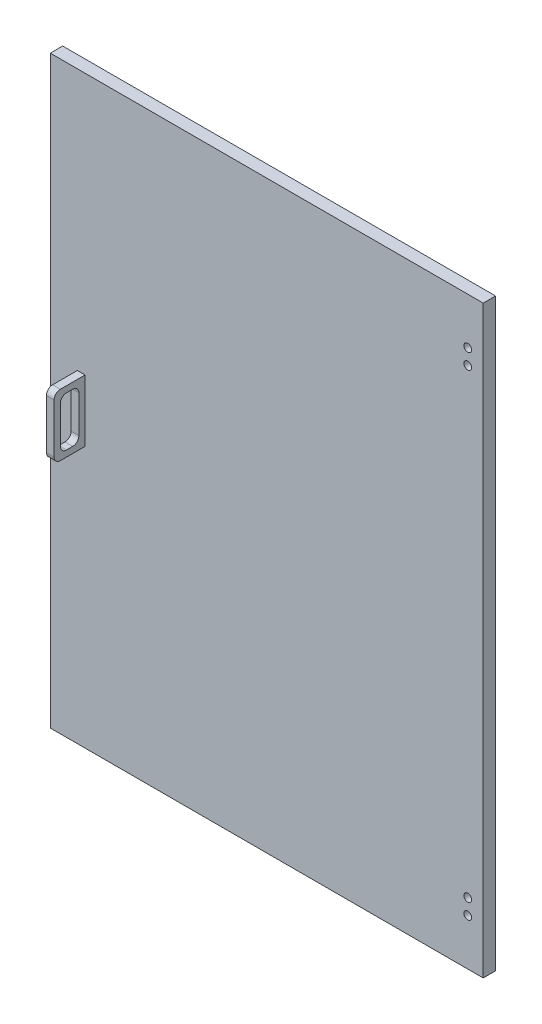
ISO-10303-21;
HEADER;
FILE_DESCRIPTION(('STEP AP214'),'2;1');
FILE_NAME('part.step','',(''),(''),'','','');
FILE_SCHEMA(('AUTOMOTIVE_DESIGN { 1 0 10303 214 1 1 1 1 }'));
ENDSEC;
DATA;
#1=APPLICATION_CONTEXT('core data for automotive mechanical design processes');
#2=APPLICATION_PROTOCOL_DEFINITION('international standard','automotive_design',2000,#1);
#3=PRODUCT_CONTEXT('',#1,'mechanical');
#4=PRODUCT('Part','Part','',(#3));
#5=PRODUCT_RELATED_PRODUCT_CATEGORY('part','',(#4));
#6=PRODUCT_DEFINITION_FORMATION('','',#4);
#7=PRODUCT_DEFINITION_CONTEXT('part definition',#1,'design');
#8=PRODUCT_DEFINITION('design','',#6,#7);
#9=PRODUCT_DEFINITION_SHAPE('','',#8);
#10=(LENGTH_UNIT() NAMED_UNIT(*) SI_UNIT(.MILLI.,.METRE.));
#11=(NAMED_UNIT(*) PLANE_ANGLE_UNIT() SI_UNIT($,.RADIAN.));
#12=(NAMED_UNIT(*) SI_UNIT($,.STERADIAN.) SOLID_ANGLE_UNIT());
#13=UNCERTAINTY_MEASURE_WITH_UNIT(LENGTH_MEASURE(1.E-05),#10,'distance_accuracy_value','');
#14=(GEOMETRIC_REPRESENTATION_CONTEXT(3) GLOBAL_UNCERTAINTY_ASSIGNED_CONTEXT((#13)) GLOBAL_UNIT_ASSIGNED_CONTEXT((#10,
#11,#12)) REPRESENTATION_CONTEXT('',''));
#15=CARTESIAN_POINT('',(0.,0.,0.));
#16=DIRECTION('',(0.,0.,1.));
#17=DIRECTION('',(1.,0.,0.));
#18=AXIS2_PLACEMENT_3D('',#15,#16,#17);
#19=CARTESIAN_POINT('',(0.,0.,0.));
#20=DIRECTION('',(0.,0.,1.));
#21=DIRECTION('',(1.,0.,0.));
#22=AXIS2_PLACEMENT_3D('',#19,#20,#21);
#23=PLANE('',#22);
#24=CARTESIAN_POINT('',(82.55,100.965,0.));
#25=DIRECTION('',(0.,0.,1.));
#26=DIRECTION('',(1.,0.,0.));
#27=AXIS2_PLACEMENT_3D('',#24,#25,#26);
#28=CIRCLE('',#27,1.58749999999999);
#29=CARTESIAN_POINT('',(84.1375,100.965,0.));
#30=VERTEX_POINT('',#29);
#31=EDGE_CURVE('E229',#30,#30,#28,.T.);
#32=ORIENTED_EDGE('',*,*,#31,.F.);
#33=EDGE_LOOP('',(#32));
#34=FACE_BOUND('',#33,.T.);
#35=CARTESIAN_POINT('',(82.55,94.615,0.));
#36=DIRECTION('',(0.,0.,1.));
#37=DIRECTION('',(1.,0.,0.));
#38=AXIS2_PLACEMENT_3D('',#35,#36,#37);
#39=CIRCLE('',#38,1.58749999999999);
#40=CARTESIAN_POINT('',(84.1375,94.615,0.));
#41=VERTEX_POINT('',#40);
#42=EDGE_CURVE('E233',#41,#41,#39,.T.);
#43=ORIENTED_EDGE('',*,*,#42,.F.);
#44=EDGE_LOOP('',(#43));
#45=FACE_BOUND('',#44,.T.);
#46=CARTESIAN_POINT('',(82.55,-94.615,0.));
#47=DIRECTION('',(0.,0.,1.));
#48=DIRECTION('',(-1.,0.,0.));
#49=AXIS2_PLACEMENT_3D('',#46,#47,#48);
#50=CIRCLE('',#49,1.58749999999999);
#51=CARTESIAN_POINT('',(80.9625,-94.615,0.));
#52=VERTEX_POINT('',#51);
#53=EDGE_CURVE('E241',#52,#52,#50,.T.);
#54=ORIENTED_EDGE('',*,*,#53,.F.);
#55=EDGE_LOOP('',(#54));
#56=FACE_BOUND('',#55,.T.);
#57=CARTESIAN_POINT('',(82.55,-100.965,0.));
#58=DIRECTION('',(0.,0.,1.));
#59=DIRECTION('',(-1.,0.,0.));
#60=AXIS2_PLACEMENT_3D('',#57,#58,#59);
#61=CIRCLE('',#60,1.58749999999999);
#62=CARTESIAN_POINT('',(80.9625,-100.965,0.));
#63=VERTEX_POINT('',#62);
#64=EDGE_CURVE('E249',#63,#63,#61,.T.);
#65=ORIENTED_EDGE('',*,*,#64,.F.);
#66=EDGE_LOOP('',(#65));
#67=FACE_BOUND('',#66,.T.);
#68=DIRECTION('',(0.,-1.,0.));
#69=VECTOR('',#68,1.);
#70=CARTESIAN_POINT('',(-88.9,120.015,0.));
#71=LINE('',#70,#69);
#72=CARTESIAN_POINT('',(-88.9,120.015,0.));
#73=VERTEX_POINT('',#72);
#74=CARTESIAN_POINT('',(-88.9,-120.015,0.));
#75=VERTEX_POINT('',#74);
#76=EDGE_CURVE('E228',#73,#75,#71,.T.);
#77=ORIENTED_EDGE('',*,*,#76,.T.);
#78=DIRECTION('',(1.,0.,0.));
#79=VECTOR('',#78,1.);
#80=CARTESIAN_POINT('',(-88.9,-120.015,0.));
#81=LINE('',#80,#79);
#82=CARTESIAN_POINT('',(88.9,-120.015,0.));
#83=VERTEX_POINT('',#82);
#84=EDGE_CURVE('E277',#75,#83,#81,.T.);
#85=ORIENTED_EDGE('',*,*,#84,.T.);
#86=DIRECTION('',(0.,1.,0.));
#87=VECTOR('',#86,1.);
#88=CARTESIAN_POINT('',(88.9,120.015,0.));
#89=LINE('',#88,#87);
#90=CARTESIAN_POINT('',(88.9,120.015,0.));
#91=VERTEX_POINT('',#90);
#92=EDGE_CURVE('E281',#83,#91,#89,.T.);
#93=ORIENTED_EDGE('',*,*,#92,.T.);
#94=DIRECTION('',(-1.,0.,0.));
#95=VECTOR('',#94,1.);
#96=CARTESIAN_POINT('',(-88.9,120.015,0.));
#97=LINE('',#96,#95);
#98=EDGE_CURVE('E261',#91,#73,#97,.T.);
#99=ORIENTED_EDGE('',*,*,#98,.T.);
#100=EDGE_LOOP('',(#77,#85,#93,#99));
#101=FACE_BOUND('',#100,.T.);
#102=DIRECTION('',(-1.,0.,0.));
#103=VECTOR('',#102,1.);
#104=CARTESIAN_POINT('',(-77.7875,12.7,0.));
#105=LINE('',#104,#103);
#106=CARTESIAN_POINT('',(-74.6125,12.7,0.));
#107=VERTEX_POINT('',#106);
#108=CARTESIAN_POINT('',(-77.7875,12.7,0.));
#109=VERTEX_POINT('',#108);
#110=EDGE_CURVE('E182',#107,#109,#105,.T.);
#111=ORIENTED_EDGE('',*,*,#110,.F.);
#112=DIRECTION('',(0.,1.,0.));
#113=VECTOR('',#112,1.);
#114=CARTESIAN_POINT('',(-74.6125,-12.7,0.));
#115=LINE('',#114,#113);
#116=CARTESIAN_POINT('',(-74.6125,-12.7,0.));
#117=VERTEX_POINT('',#116);
#118=EDGE_CURVE('E193',#117,#107,#115,.T.);
#119=ORIENTED_EDGE('',*,*,#118,.F.);
#120=DIRECTION('',(1.,0.,0.));
#121=VECTOR('',#120,1.);
#122=CARTESIAN_POINT('',(-77.7875,-12.7,0.));
#123=LINE('',#122,#121);
#124=CARTESIAN_POINT('',(-77.7875,-12.7,0.));
#125=VERTEX_POINT('',#124);
#126=EDGE_CURVE('E209',#125,#117,#123,.T.);
#127=ORIENTED_EDGE('',*,*,#126,.F.);
#128=DIRECTION('',(0.,-1.,0.));
#129=VECTOR('',#128,1.);
#130=CARTESIAN_POINT('',(-77.7875,-12.7,0.));
#131=LINE('',#130,#129);
#132=EDGE_CURVE('E205',#109,#125,#131,.T.);
#133=ORIENTED_EDGE('',*,*,#132,.F.);
#134=EDGE_LOOP('',(#111,#119,#127,#133));
#135=FACE_BOUND('',#134,.T.);
#136=ADVANCED_FACE('F51',(#34,#45,#56,#67,#101,#135),#23,.T.);
#137=CARTESIAN_POINT('',(-88.9,120.015,-5.08));
#138=DIRECTION('',(-1.,0.,0.));
#139=DIRECTION('',(0.,-1.,0.));
#140=AXIS2_PLACEMENT_3D('',#137,#138,#139);
#141=PLANE('',#140);
#142=ORIENTED_EDGE('',*,*,#76,.F.);
#143=DIRECTION('',(0.,0.,1.));
#144=VECTOR('',#143,1.);
#145=CARTESIAN_POINT('',(-88.9,120.015,-5.08));
#146=LINE('',#145,#144);
#147=CARTESIAN_POINT('',(-88.9,120.015,-5.08));
#148=VERTEX_POINT('',#147);
#149=EDGE_CURVE('E288',#148,#73,#146,.T.);
#150=ORIENTED_EDGE('',*,*,#149,.F.);
#151=DIRECTION('',(0.,-1.,0.));
#152=VECTOR('',#151,1.);
#153=CARTESIAN_POINT('',(-88.9,120.015,-5.08));
#154=LINE('',#153,#152);
#155=CARTESIAN_POINT('',(-88.9,-120.015,-5.08));
#156=VERTEX_POINT('',#155);
#157=EDGE_CURVE('E256',#148,#156,#154,.T.);
#158=ORIENTED_EDGE('',*,*,#157,.T.);
#159=DIRECTION('',(0.,0.,1.));
#160=VECTOR('',#159,1.);
#161=CARTESIAN_POINT('',(-88.9,-120.015,-5.08));
#162=LINE('',#161,#160);
#163=EDGE_CURVE('E273',#156,#75,#162,.T.);
#164=ORIENTED_EDGE('',*,*,#163,.T.);
#165=EDGE_LOOP('',(#142,#150,#158,#164));
#166=FACE_BOUND('',#165,.T.);
#167=ADVANCED_FACE('F445',(#166),#141,.T.);
#168=CARTESIAN_POINT('',(-88.9,120.015,-5.08));
#169=DIRECTION('',(0.,1.,0.));
#170=DIRECTION('',(0.,0.,1.));
#171=AXIS2_PLACEMENT_3D('',#168,#169,#170);
#172=PLANE('',#171);
#173=ORIENTED_EDGE('',*,*,#98,.F.);
#174=DIRECTION('',(0.,0.,1.));
#175=VECTOR('',#174,1.);
#176=CARTESIAN_POINT('',(88.9,120.015,-5.08));
#177=LINE('',#176,#175);
#178=CARTESIAN_POINT('',(88.9,120.015,-5.08));
#179=VERTEX_POINT('',#178);
#180=EDGE_CURVE('E292',#179,#91,#177,.T.);
#181=ORIENTED_EDGE('',*,*,#180,.F.);
#182=DIRECTION('',(-1.,0.,0.));
#183=VECTOR('',#182,1.);
#184=CARTESIAN_POINT('',(-88.9,120.015,-5.08));
#185=LINE('',#184,#183);
#186=EDGE_CURVE('E269',#179,#148,#185,.T.);
#187=ORIENTED_EDGE('',*,*,#186,.T.);
#188=ORIENTED_EDGE('',*,*,#149,.T.);
#189=EDGE_LOOP('',(#173,#181,#187,#188));
#190=FACE_BOUND('',#189,.T.);
#191=ADVANCED_FACE('F451',(#190),#172,.T.);
#192=CARTESIAN_POINT('',(88.9,120.015,-5.08));
#193=DIRECTION('',(1.,0.,0.));
#194=DIRECTION('',(0.,1.,0.));
#195=AXIS2_PLACEMENT_3D('',#192,#193,#194);
#196=PLANE('',#195);
#197=ORIENTED_EDGE('',*,*,#92,.F.);
#198=DIRECTION('',(0.,0.,1.));
#199=VECTOR('',#198,1.);
#200=CARTESIAN_POINT('',(88.9,-120.015,-5.08));
#201=LINE('',#200,#199);
#202=CARTESIAN_POINT('',(88.9,-120.015,-5.08));
#203=VERTEX_POINT('',#202);
#204=EDGE_CURVE('E295',#203,#83,#201,.T.);
#205=ORIENTED_EDGE('',*,*,#204,.F.);
#206=DIRECTION('',(0.,1.,0.));
#207=VECTOR('',#206,1.);
#208=CARTESIAN_POINT('',(88.9,120.015,-5.08));
#209=LINE('',#208,#207);
#210=EDGE_CURVE('E265',#203,#179,#209,.T.);
#211=ORIENTED_EDGE('',*,*,#210,.T.);
#212=ORIENTED_EDGE('',*,*,#180,.T.);
#213=EDGE_LOOP('',(#197,#205,#211,#212));
#214=FACE_BOUND('',#213,.T.);
#215=ADVANCED_FACE('F462',(#214),#196,.T.);
#216=CARTESIAN_POINT('',(-88.9,-120.015,-5.08));
#217=DIRECTION('',(0.,-1.,0.));
#218=DIRECTION('',(0.,0.,-1.));
#219=AXIS2_PLACEMENT_3D('',#216,#217,#218);
#220=PLANE('',#219);
#221=ORIENTED_EDGE('',*,*,#84,.F.);
#222=ORIENTED_EDGE('',*,*,#163,.F.);
#223=DIRECTION('',(1.,0.,0.));
#224=VECTOR('',#223,1.);
#225=CARTESIAN_POINT('',(-88.9,-120.015,-5.08));
#226=LINE('',#225,#224);
#227=EDGE_CURVE('E260',#156,#203,#226,.T.);
#228=ORIENTED_EDGE('',*,*,#227,.T.);
#229=ORIENTED_EDGE('',*,*,#204,.T.);
#230=EDGE_LOOP('',(#221,#222,#228,#229));
#231=FACE_BOUND('',#230,.T.);
#232=ADVANCED_FACE('F466',(#231),#220,.T.);
#233=CARTESIAN_POINT('',(0.,0.,-5.08));
#234=DIRECTION('',(0.,0.,1.));
#235=DIRECTION('',(1.,0.,0.));
#236=AXIS2_PLACEMENT_3D('',#233,#234,#235);
#237=PLANE('',#236);
#238=CARTESIAN_POINT('',(82.55,100.965,-5.08));
#239=DIRECTION('',(0.,0.,1.));
#240=DIRECTION('',(1.,0.,0.));
#241=AXIS2_PLACEMENT_3D('',#238,#239,#240);
#242=CIRCLE('',#241,1.58749999999999);
#243=CARTESIAN_POINT('',(84.1375,100.965,-5.08));
#244=VERTEX_POINT('',#243);
#245=EDGE_CURVE('E224',#244,#244,#242,.T.);
#246=ORIENTED_EDGE('',*,*,#245,.T.);
#247=EDGE_LOOP('',(#246));
#248=FACE_BOUND('',#247,.T.);
#249=CARTESIAN_POINT('',(82.55,94.615,-5.08));
#250=DIRECTION('',(0.,0.,1.));
#251=DIRECTION('',(1.,0.,0.));
#252=AXIS2_PLACEMENT_3D('',#249,#250,#251);
#253=CIRCLE('',#252,1.58749999999999);
#254=CARTESIAN_POINT('',(84.1375,94.615,-5.08));
#255=VERTEX_POINT('',#254);
#256=EDGE_CURVE('E237',#255,#255,#253,.T.);
#257=ORIENTED_EDGE('',*,*,#256,.T.);
#258=EDGE_LOOP('',(#257));
#259=FACE_BOUND('',#258,.T.);
#260=CARTESIAN_POINT('',(82.55,-94.615,-5.08));
#261=DIRECTION('',(0.,0.,1.));
#262=DIRECTION('',(-1.,0.,0.));
#263=AXIS2_PLACEMENT_3D('',#260,#261,#262);
#264=CIRCLE('',#263,1.58749999999999);
#265=CARTESIAN_POINT('',(80.9625,-94.615,-5.08));
#266=VERTEX_POINT('',#265);
#267=EDGE_CURVE('E245',#266,#266,#264,.T.);
#268=ORIENTED_EDGE('',*,*,#267,.T.);
#269=EDGE_LOOP('',(#268));
#270=FACE_BOUND('',#269,.T.);
#271=CARTESIAN_POINT('',(82.55,-100.965,-5.08));
#272=DIRECTION('',(0.,0.,1.));
#273=DIRECTION('',(-1.,0.,0.));
#274=AXIS2_PLACEMENT_3D('',#271,#272,#273);
#275=CIRCLE('',#274,1.58749999999999);
#276=CARTESIAN_POINT('',(80.9625,-100.965,-5.08));
#277=VERTEX_POINT('',#276);
#278=EDGE_CURVE('E189',#277,#277,#275,.T.);
#279=ORIENTED_EDGE('',*,*,#278,.T.);
#280=EDGE_LOOP('',(#279));
#281=FACE_BOUND('',#280,.T.);
#282=ORIENTED_EDGE('',*,*,#157,.F.);
#283=ORIENTED_EDGE('',*,*,#186,.F.);
#284=ORIENTED_EDGE('',*,*,#210,.F.);
#285=ORIENTED_EDGE('',*,*,#227,.F.);
#286=EDGE_LOOP('',(#282,#283,#284,#285));
#287=FACE_BOUND('',#286,.T.);
#288=ADVANCED_FACE('F458',(#248,#259,#270,#281,#287),#237,.F.);
#289=CARTESIAN_POINT('',(82.55,-100.965,-5.08));
#290=DIRECTION('',(0.,0.,1.));
#291=DIRECTION('',(1.,0.,0.));
#292=AXIS2_PLACEMENT_3D('',#289,#290,#291);
#293=CYLINDRICAL_SURFACE('',#292,1.58749999999999);
#294=ORIENTED_EDGE('',*,*,#278,.F.);
#295=EDGE_LOOP('',(#294));
#296=FACE_BOUND('',#295,.T.);
#297=ORIENTED_EDGE('',*,*,#64,.T.);
#298=EDGE_LOOP('',(#297));
#299=FACE_BOUND('',#298,.T.);
#300=ADVANCED_FACE('F612',(#296,#299),#293,.F.);
#301=CARTESIAN_POINT('',(82.55,-94.615,-5.08));
#302=DIRECTION('',(0.,0.,1.));
#303=DIRECTION('',(1.,0.,0.));
#304=AXIS2_PLACEMENT_3D('',#301,#302,#303);
#305=CYLINDRICAL_SURFACE('',#304,1.58749999999999);
#306=ORIENTED_EDGE('',*,*,#267,.F.);
#307=EDGE_LOOP('',(#306));
#308=FACE_BOUND('',#307,.T.);
#309=ORIENTED_EDGE('',*,*,#53,.T.);
#310=EDGE_LOOP('',(#309));
#311=FACE_BOUND('',#310,.T.);
#312=ADVANCED_FACE('F602',(#308,#311),#305,.F.);
#313=CARTESIAN_POINT('',(82.55,94.615,-5.08));
#314=DIRECTION('',(0.,0.,1.));
#315=DIRECTION('',(1.,0.,0.));
#316=AXIS2_PLACEMENT_3D('',#313,#314,#315);
#317=CYLINDRICAL_SURFACE('',#316,1.58749999999999);
#318=ORIENTED_EDGE('',*,*,#256,.F.);
#319=EDGE_LOOP('',(#318));
#320=FACE_BOUND('',#319,.T.);
#321=ORIENTED_EDGE('',*,*,#42,.T.);
#322=EDGE_LOOP('',(#321));
#323=FACE_BOUND('',#322,.T.);
#324=ADVANCED_FACE('F593',(#320,#323),#317,.F.);
#325=CARTESIAN_POINT('',(82.55,100.965,-5.08));
#326=DIRECTION('',(0.,0.,1.));
#327=DIRECTION('',(1.,0.,0.));
#328=AXIS2_PLACEMENT_3D('',#325,#326,#327);
#329=CYLINDRICAL_SURFACE('',#328,1.58749999999999);
#330=ORIENTED_EDGE('',*,*,#245,.F.);
#331=EDGE_LOOP('',(#330));
#332=FACE_BOUND('',#331,.T.);
#333=ORIENTED_EDGE('',*,*,#31,.T.);
#334=EDGE_LOOP('',(#333));
#335=FACE_BOUND('',#334,.T.);
#336=ADVANCED_FACE('F577',(#332,#335),#329,.F.);
#337=CARTESIAN_POINT('',(-74.6125,-12.7,12.7));
#338=DIRECTION('',(-1.,0.,0.));
#339=DIRECTION('',(0.,0.,1.));
#340=AXIS2_PLACEMENT_3D('',#337,#338,#339);
#341=PLANE('',#340);
#342=DIRECTION('',(0.,0.,1.));
#343=VECTOR('',#342,1.);
#344=CARTESIAN_POINT('',(-74.6125,10.16,10.16));
#345=LINE('',#344,#343);
#346=CARTESIAN_POINT('',(-74.6125,10.16,5.08));
#347=VERTEX_POINT('',#346);
#348=CARTESIAN_POINT('',(-74.6125,10.16,7.62));
#349=VERTEX_POINT('',#348);
#350=EDGE_CURVE('E389',#347,#349,#345,.T.);
#351=ORIENTED_EDGE('',*,*,#350,.F.);
#352=CARTESIAN_POINT('',(-74.6125,7.61999999999998,5.08));
#353=DIRECTION('',(-1.,0.,0.));
#354=DIRECTION('',(0.,0.,1.));
#355=AXIS2_PLACEMENT_3D('',#352,#353,#354);
#356=CIRCLE('',#355,2.54);
#357=CARTESIAN_POINT('',(-74.6125,7.61999999999998,2.54));
#358=VERTEX_POINT('',#357);
#359=EDGE_CURVE('E60',#347,#358,#356,.T.);
#360=ORIENTED_EDGE('',*,*,#359,.T.);
#361=DIRECTION('',(0.,1.,0.));
#362=VECTOR('',#361,1.);
#363=CARTESIAN_POINT('',(-74.6125,-10.16,2.54));
#364=LINE('',#363,#362);
#365=CARTESIAN_POINT('',(-74.6125,-7.61999999999998,2.54));
#366=VERTEX_POINT('',#365);
#367=EDGE_CURVE('E387',#366,#358,#364,.T.);
#368=ORIENTED_EDGE('',*,*,#367,.F.);
#369=CARTESIAN_POINT('',(-74.6125,-7.61999999999998,5.08));
#370=DIRECTION('',(-1.,0.,0.));
#371=DIRECTION('',(0.,0.,1.));
#372=AXIS2_PLACEMENT_3D('',#369,#370,#371);
#373=CIRCLE('',#372,2.54);
#374=CARTESIAN_POINT('',(-74.6125,-10.16,5.08));
#375=VERTEX_POINT('',#374);
#376=EDGE_CURVE('E365',#366,#375,#373,.T.);
#377=ORIENTED_EDGE('',*,*,#376,.T.);
#378=DIRECTION('',(0.,0.,-1.));
#379=VECTOR('',#378,1.);
#380=CARTESIAN_POINT('',(-74.6125,-10.16,10.16));
#381=LINE('',#380,#379);
#382=CARTESIAN_POINT('',(-74.6125,-10.16,7.62));
#383=VERTEX_POINT('',#382);
#384=EDGE_CURVE('E202',#383,#375,#381,.T.);
#385=ORIENTED_EDGE('',*,*,#384,.F.);
#386=CARTESIAN_POINT('',(-74.6125,-7.61999999999998,7.62));
#387=DIRECTION('',(-1.,0.,0.));
#388=DIRECTION('',(0.,0.,1.));
#389=AXIS2_PLACEMENT_3D('',#386,#387,#388);
#390=CIRCLE('',#389,2.54);
#391=CARTESIAN_POINT('',(-74.6125,-7.61999999999998,10.16));
#392=VERTEX_POINT('',#391);
#393=EDGE_CURVE('E371',#383,#392,#390,.T.);
#394=ORIENTED_EDGE('',*,*,#393,.T.);
#395=DIRECTION('',(0.,-1.,0.));
#396=VECTOR('',#395,1.);
#397=CARTESIAN_POINT('',(-74.6125,-10.16,10.16));
#398=LINE('',#397,#396);
#399=CARTESIAN_POINT('',(-74.6125,7.61999999999998,10.16));
#400=VERTEX_POINT('',#399);
#401=EDGE_CURVE('E414',#400,#392,#398,.T.);
#402=ORIENTED_EDGE('',*,*,#401,.F.);
#403=CARTESIAN_POINT('',(-74.6125,7.61999999999998,7.62));
#404=DIRECTION('',(-1.,0.,0.));
#405=DIRECTION('',(0.,0.,1.));
#406=AXIS2_PLACEMENT_3D('',#403,#404,#405);
#407=CIRCLE('',#406,2.54);
#408=EDGE_CURVE('E377',#400,#349,#407,.T.);
#409=ORIENTED_EDGE('',*,*,#408,.T.);
#410=EDGE_LOOP('',(#351,#360,#368,#377,#385,#394,#402,#409));
#411=FACE_BOUND('',#410,.T.);
#412=DIRECTION('',(0.,1.,0.));
#413=VECTOR('',#412,1.);
#414=CARTESIAN_POINT('',(-74.6125,-12.7,12.7));
#415=LINE('',#414,#413);
#416=CARTESIAN_POINT('',(-74.6125,-10.16,12.7));
#417=VERTEX_POINT('',#416);
#418=CARTESIAN_POINT('',(-74.6125,10.16,12.7));
#419=VERTEX_POINT('',#418);
#420=EDGE_CURVE('E215',#417,#419,#415,.T.);
#421=ORIENTED_EDGE('',*,*,#420,.F.);
#422=CARTESIAN_POINT('',(-74.6125,-10.16,10.16));
#423=DIRECTION('',(-1.,0.,0.));
#424=DIRECTION('',(0.,0.,1.));
#425=AXIS2_PLACEMENT_3D('',#422,#423,#424);
#426=CIRCLE('',#425,2.54);
#427=CARTESIAN_POINT('',(-74.6125,-12.7,10.16));
#428=VERTEX_POINT('',#427);
#429=EDGE_CURVE('E325',#417,#428,#426,.F.);
#430=ORIENTED_EDGE('',*,*,#429,.T.);
#431=DIRECTION('',(0.,0.,-1.));
#432=VECTOR('',#431,1.);
#433=CARTESIAN_POINT('',(-74.6125,-12.7,12.7));
#434=LINE('',#433,#432);
#435=EDGE_CURVE('E197',#428,#117,#434,.T.);
#436=ORIENTED_EDGE('',*,*,#435,.T.);
#437=ORIENTED_EDGE('',*,*,#118,.T.);
#438=DIRECTION('',(0.,0.,-1.));
#439=VECTOR('',#438,1.);
#440=CARTESIAN_POINT('',(-74.6125,12.7,12.7));
#441=LINE('',#440,#439);
#442=CARTESIAN_POINT('',(-74.6125,12.7,10.16));
#443=VERTEX_POINT('',#442);
#444=EDGE_CURVE('E178',#443,#107,#441,.T.);
#445=ORIENTED_EDGE('',*,*,#444,.F.);
#446=CARTESIAN_POINT('',(-74.6125,10.16,10.16));
#447=DIRECTION('',(-1.,0.,0.));
#448=DIRECTION('',(0.,0.,1.));
#449=AXIS2_PLACEMENT_3D('',#446,#447,#448);
#450=CIRCLE('',#449,2.54);
#451=EDGE_CURVE('E322',#443,#419,#450,.F.);
#452=ORIENTED_EDGE('',*,*,#451,.T.);
#453=EDGE_LOOP('',(#421,#430,#436,#437,#445,#452));
#454=FACE_BOUND('',#453,.T.);
#455=ADVANCED_FACE('F195',(#411,#454),#341,.F.);
#456=CARTESIAN_POINT('',(-77.7875,12.7,12.7));
#457=DIRECTION('',(0.,-1.,0.));
#458=DIRECTION('',(0.,0.,-1.));
#459=AXIS2_PLACEMENT_3D('',#456,#457,#458);
#460=PLANE('',#459);
#461=DIRECTION('',(0.,0.,-1.));
#462=VECTOR('',#461,1.);
#463=CARTESIAN_POINT('',(-77.7875,12.7,12.7));
#464=LINE('',#463,#462);
#465=CARTESIAN_POINT('',(-77.7875,12.7,10.16));
#466=VERTEX_POINT('',#465);
#467=EDGE_CURVE('E190',#466,#109,#464,.T.);
#468=ORIENTED_EDGE('',*,*,#467,.F.);
#469=DIRECTION('',(-1.,0.,0.));
#470=VECTOR('',#469,1.);
#471=CARTESIAN_POINT('',(-77.7875,12.7,10.16));
#472=LINE('',#471,#470);
#473=EDGE_CURVE('E185',#466,#443,#472,.F.);
#474=ORIENTED_EDGE('',*,*,#473,.T.);
#475=ORIENTED_EDGE('',*,*,#444,.T.);
#476=ORIENTED_EDGE('',*,*,#110,.T.);
#477=EDGE_LOOP('',(#468,#474,#475,#476));
#478=FACE_BOUND('',#477,.T.);
#479=ADVANCED_FACE('F180',(#478),#460,.F.);
#480=CARTESIAN_POINT('',(-77.7875,-12.7,12.7));
#481=DIRECTION('',(1.,0.,0.));
#482=DIRECTION('',(0.,0.,-1.));
#483=AXIS2_PLACEMENT_3D('',#480,#481,#482);
#484=PLANE('',#483);
#485=DIRECTION('',(0.,-1.,0.));
#486=VECTOR('',#485,1.);
#487=CARTESIAN_POINT('',(-77.7875,-12.7,10.16));
#488=LINE('',#487,#486);
#489=CARTESIAN_POINT('',(-77.7875,7.61999999999998,10.16));
#490=VERTEX_POINT('',#489);
#491=CARTESIAN_POINT('',(-77.7875,-7.61999999999998,10.16));
#492=VERTEX_POINT('',#491);
#493=EDGE_CURVE('E303',#490,#492,#488,.T.);
#494=ORIENTED_EDGE('',*,*,#493,.T.);
#495=CARTESIAN_POINT('',(-77.7875,-7.61999999999998,7.62));
#496=DIRECTION('',(1.,0.,0.));
#497=DIRECTION('',(0.,0.,-1.));
#498=AXIS2_PLACEMENT_3D('',#495,#496,#497);
#499=CIRCLE('',#498,2.54);
#500=CARTESIAN_POINT('',(-77.7875,-10.16,7.62));
#501=VERTEX_POINT('',#500);
#502=EDGE_CURVE('E374',#492,#501,#499,.T.);
#503=ORIENTED_EDGE('',*,*,#502,.T.);
#504=DIRECTION('',(0.,0.,-1.));
#505=VECTOR('',#504,1.);
#506=CARTESIAN_POINT('',(-77.7875,-10.16,12.7));
#507=LINE('',#506,#505);
#508=CARTESIAN_POINT('',(-77.7875,-10.16,5.08));
#509=VERTEX_POINT('',#508);
#510=EDGE_CURVE('E306',#501,#509,#507,.T.);
#511=ORIENTED_EDGE('',*,*,#510,.T.);
#512=CARTESIAN_POINT('',(-77.7875,-7.61999999999998,5.08));
#513=DIRECTION('',(1.,0.,0.));
#514=DIRECTION('',(0.,0.,-1.));
#515=AXIS2_PLACEMENT_3D('',#512,#513,#514);
#516=CIRCLE('',#515,2.54);
#517=CARTESIAN_POINT('',(-77.7875,-7.61999999999998,2.54));
#518=VERTEX_POINT('',#517);
#519=EDGE_CURVE('E368',#509,#518,#516,.T.);
#520=ORIENTED_EDGE('',*,*,#519,.T.);
#521=DIRECTION('',(0.,1.,0.));
#522=VECTOR('',#521,1.);
#523=CARTESIAN_POINT('',(-77.7875,-12.7,2.54));
#524=LINE('',#523,#522);
#525=CARTESIAN_POINT('',(-77.7875,7.61999999999998,2.54));
#526=VERTEX_POINT('',#525);
#527=EDGE_CURVE('E310',#518,#526,#524,.T.);
#528=ORIENTED_EDGE('',*,*,#527,.T.);
#529=CARTESIAN_POINT('',(-77.7875,7.61999999999998,5.08));
#530=DIRECTION('',(1.,0.,0.));
#531=DIRECTION('',(0.,0.,-1.));
#532=AXIS2_PLACEMENT_3D('',#529,#530,#531);
#533=CIRCLE('',#532,2.54);
#534=CARTESIAN_POINT('',(-77.7875,10.16,5.08));
#535=VERTEX_POINT('',#534);
#536=EDGE_CURVE('E11',#526,#535,#533,.T.);
#537=ORIENTED_EDGE('',*,*,#536,.T.);
#538=DIRECTION('',(0.,0.,1.));
#539=VECTOR('',#538,1.);
#540=CARTESIAN_POINT('',(-77.7875,10.16,12.7));
#541=LINE('',#540,#539);
#542=CARTESIAN_POINT('',(-77.7875,10.16,7.62));
#543=VERTEX_POINT('',#542);
#544=EDGE_CURVE('E291',#535,#543,#541,.T.);
#545=ORIENTED_EDGE('',*,*,#544,.T.);
#546=CARTESIAN_POINT('',(-77.7875,7.61999999999998,7.62));
#547=DIRECTION('',(1.,0.,0.));
#548=DIRECTION('',(0.,0.,-1.));
#549=AXIS2_PLACEMENT_3D('',#546,#547,#548);
#550=CIRCLE('',#549,2.54);
#551=EDGE_CURVE('E380',#543,#490,#550,.T.);
#552=ORIENTED_EDGE('',*,*,#551,.T.);
#553=EDGE_LOOP('',(#494,#503,#511,#520,#528,#537,#545,#552));
#554=FACE_BOUND('',#553,.T.);
#555=DIRECTION('',(0.,0.,-1.));
#556=VECTOR('',#555,1.);
#557=CARTESIAN_POINT('',(-77.7875,-12.7,12.7));
#558=LINE('',#557,#556);
#559=CARTESIAN_POINT('',(-77.7875,-12.7,10.16));
#560=VERTEX_POINT('',#559);
#561=EDGE_CURVE('E218',#560,#125,#558,.T.);
#562=ORIENTED_EDGE('',*,*,#561,.F.);
#563=CARTESIAN_POINT('',(-77.7875,-10.16,10.16));
#564=DIRECTION('',(1.,0.,0.));
#565=DIRECTION('',(0.,0.,-1.));
#566=AXIS2_PLACEMENT_3D('',#563,#564,#565);
#567=CIRCLE('',#566,2.54);
#568=CARTESIAN_POINT('',(-77.7875,-10.16,12.7));
#569=VERTEX_POINT('',#568);
#570=EDGE_CURVE('E333',#560,#569,#567,.F.);
#571=ORIENTED_EDGE('',*,*,#570,.T.);
#572=DIRECTION('',(0.,-1.,0.));
#573=VECTOR('',#572,1.);
#574=CARTESIAN_POINT('',(-77.7875,-12.7,12.7));
#575=LINE('',#574,#573);
#576=CARTESIAN_POINT('',(-77.7875,10.16,12.7));
#577=VERTEX_POINT('',#576);
#578=EDGE_CURVE('E219',#577,#569,#575,.T.);
#579=ORIENTED_EDGE('',*,*,#578,.F.);
#580=CARTESIAN_POINT('',(-77.7875,10.16,10.16));
#581=DIRECTION('',(1.,0.,0.));
#582=DIRECTION('',(0.,0.,-1.));
#583=AXIS2_PLACEMENT_3D('',#580,#581,#582);
#584=CIRCLE('',#583,2.54);
#585=EDGE_CURVE('E67',#577,#466,#584,.F.);
#586=ORIENTED_EDGE('',*,*,#585,.T.);
#587=ORIENTED_EDGE('',*,*,#467,.T.);
#588=ORIENTED_EDGE('',*,*,#132,.T.);
#589=EDGE_LOOP('',(#562,#571,#579,#586,#587,#588));
#590=FACE_BOUND('',#589,.T.);
#591=ADVANCED_FACE('F403',(#554,#590),#484,.F.);
#592=CARTESIAN_POINT('',(-77.7875,-12.7,12.7));
#593=DIRECTION('',(0.,1.,0.));
#594=DIRECTION('',(0.,0.,1.));
#595=AXIS2_PLACEMENT_3D('',#592,#593,#594);
#596=PLANE('',#595);
#597=ORIENTED_EDGE('',*,*,#435,.F.);
#598=DIRECTION('',(1.,0.,0.));
#599=VECTOR('',#598,1.);
#600=CARTESIAN_POINT('',(-77.7875,-12.7,10.16));
#601=LINE('',#600,#599);
#602=EDGE_CURVE('E328',#428,#560,#601,.F.);
#603=ORIENTED_EDGE('',*,*,#602,.T.);
#604=ORIENTED_EDGE('',*,*,#561,.T.);
#605=ORIENTED_EDGE('',*,*,#126,.T.);
#606=EDGE_LOOP('',(#597,#603,#604,#605));
#607=FACE_BOUND('',#606,.T.);
#608=ADVANCED_FACE('F437',(#607),#596,.F.);
#609=CARTESIAN_POINT('',(0.,0.,12.7));
#610=DIRECTION('',(0.,0.,-1.));
#611=DIRECTION('',(-1.,0.,0.));
#612=AXIS2_PLACEMENT_3D('',#609,#610,#611);
#613=PLANE('',#612);
#614=ORIENTED_EDGE('',*,*,#578,.T.);
#615=DIRECTION('',(1.,0.,0.));
#616=VECTOR('',#615,1.);
#617=CARTESIAN_POINT('',(0.,-10.16,12.7));
#618=LINE('',#617,#616);
#619=EDGE_CURVE('E318',#569,#417,#618,.T.);
#620=ORIENTED_EDGE('',*,*,#619,.T.);
#621=ORIENTED_EDGE('',*,*,#420,.T.);
#622=DIRECTION('',(-1.,0.,0.));
#623=VECTOR('',#622,1.);
#624=CARTESIAN_POINT('',(0.,10.16,12.7));
#625=LINE('',#624,#623);
#626=EDGE_CURVE('E314',#419,#577,#625,.T.);
#627=ORIENTED_EDGE('',*,*,#626,.T.);
#628=EDGE_LOOP('',(#614,#620,#621,#627));
#629=FACE_BOUND('',#628,.T.);
#630=ADVANCED_FACE('F430',(#629),#613,.F.);
#631=CARTESIAN_POINT('',(-88.9,-10.16,2.54));
#632=DIRECTION('',(0.,0.,-1.));
#633=DIRECTION('',(-1.,0.,0.));
#634=AXIS2_PLACEMENT_3D('',#631,#632,#633);
#635=PLANE('',#634);
#636=ORIENTED_EDGE('',*,*,#527,.F.);
#637=DIRECTION('',(1.,0.,0.));
#638=VECTOR('',#637,1.);
#639=CARTESIAN_POINT('',(-74.6125,-7.61999999999998,2.54));
#640=LINE('',#639,#638);
#641=EDGE_CURVE('E339',#518,#366,#640,.T.);
#642=ORIENTED_EDGE('',*,*,#641,.T.);
#643=ORIENTED_EDGE('',*,*,#367,.T.);
#644=DIRECTION('',(1.,0.,0.));
#645=VECTOR('',#644,1.);
#646=CARTESIAN_POINT('',(-77.7875,7.61999999999998,2.54));
#647=LINE('',#646,#645);
#648=EDGE_CURVE('E336',#358,#526,#647,.F.);
#649=ORIENTED_EDGE('',*,*,#648,.T.);
#650=EDGE_LOOP('',(#636,#642,#643,#649));
#651=FACE_BOUND('',#650,.T.);
#652=ADVANCED_FACE('F395',(#651),#635,.F.);
#653=CARTESIAN_POINT('',(-88.9,-10.16,10.16));
#654=DIRECTION('',(0.,-1.,0.));
#655=DIRECTION('',(0.,0.,-1.));
#656=AXIS2_PLACEMENT_3D('',#653,#654,#655);
#657=PLANE('',#656);
#658=ORIENTED_EDGE('',*,*,#384,.T.);
#659=DIRECTION('',(1.,0.,0.));
#660=VECTOR('',#659,1.);
#661=CARTESIAN_POINT('',(-77.7875,-10.16,5.08));
#662=LINE('',#661,#660);
#663=EDGE_CURVE('E347',#375,#509,#662,.F.);
#664=ORIENTED_EDGE('',*,*,#663,.T.);
#665=ORIENTED_EDGE('',*,*,#510,.F.);
#666=DIRECTION('',(1.,0.,0.));
#667=VECTOR('',#666,1.);
#668=CARTESIAN_POINT('',(-74.6125,-10.16,7.62));
#669=LINE('',#668,#667);
#670=EDGE_CURVE('E343',#501,#383,#669,.T.);
#671=ORIENTED_EDGE('',*,*,#670,.T.);
#672=EDGE_LOOP('',(#658,#664,#665,#671));
#673=FACE_BOUND('',#672,.T.);
#674=ADVANCED_FACE('F526',(#673),#657,.F.);
#675=CARTESIAN_POINT('',(-88.9,-10.16,10.16));
#676=DIRECTION('',(0.,0.,1.));
#677=DIRECTION('',(1.,0.,0.));
#678=AXIS2_PLACEMENT_3D('',#675,#676,#677);
#679=PLANE('',#678);
#680=ORIENTED_EDGE('',*,*,#401,.T.);
#681=DIRECTION('',(1.,0.,0.));
#682=VECTOR('',#681,1.);
#683=CARTESIAN_POINT('',(-77.7875,-7.61999999999998,10.16));
#684=LINE('',#683,#682);
#685=EDGE_CURVE('E75',#392,#492,#684,.F.);
#686=ORIENTED_EDGE('',*,*,#685,.T.);
#687=ORIENTED_EDGE('',*,*,#493,.F.);
#688=DIRECTION('',(1.,0.,0.));
#689=VECTOR('',#688,1.);
#690=CARTESIAN_POINT('',(-74.6125,7.61999999999998,10.16));
#691=LINE('',#690,#689);
#692=EDGE_CURVE('E350',#490,#400,#691,.T.);
#693=ORIENTED_EDGE('',*,*,#692,.T.);
#694=EDGE_LOOP('',(#680,#686,#687,#693));
#695=FACE_BOUND('',#694,.T.);
#696=ADVANCED_FACE('F412',(#695),#679,.F.);
#697=CARTESIAN_POINT('',(-88.9,10.16,10.16));
#698=DIRECTION('',(0.,1.,0.));
#699=DIRECTION('',(0.,0.,1.));
#700=AXIS2_PLACEMENT_3D('',#697,#698,#699);
#701=PLANE('',#700);
#702=ORIENTED_EDGE('',*,*,#350,.T.);
#703=DIRECTION('',(1.,0.,0.));
#704=VECTOR('',#703,1.);
#705=CARTESIAN_POINT('',(-77.7875,10.16,7.62));
#706=LINE('',#705,#704);
#707=EDGE_CURVE('E360',#349,#543,#706,.F.);
#708=ORIENTED_EDGE('',*,*,#707,.T.);
#709=ORIENTED_EDGE('',*,*,#544,.F.);
#710=DIRECTION('',(1.,0.,0.));
#711=VECTOR('',#710,1.);
#712=CARTESIAN_POINT('',(-74.6125,10.16,5.08));
#713=LINE('',#712,#711);
#714=EDGE_CURVE('E356',#535,#347,#713,.T.);
#715=ORIENTED_EDGE('',*,*,#714,.T.);
#716=EDGE_LOOP('',(#702,#708,#709,#715));
#717=FACE_BOUND('',#716,.T.);
#718=ADVANCED_FACE('F406',(#717),#701,.F.);
#719=CARTESIAN_POINT('',(0.,-10.16,10.16));
#720=DIRECTION('',(1.,0.,0.));
#721=DIRECTION('',(0.,0.,-1.));
#722=AXIS2_PLACEMENT_3D('',#719,#720,#721);
#723=CYLINDRICAL_SURFACE('',#722,2.54);
#724=ORIENTED_EDGE('',*,*,#570,.F.);
#725=ORIENTED_EDGE('',*,*,#602,.F.);
#726=ORIENTED_EDGE('',*,*,#429,.F.);
#727=ORIENTED_EDGE('',*,*,#619,.F.);
#728=EDGE_LOOP('',(#724,#725,#726,#727));
#729=FACE_BOUND('',#728,.T.);
#730=ADVANCED_FACE('F434',(#729),#723,.T.);
#731=CARTESIAN_POINT('',(-88.9,-7.61999999999998,5.08));
#732=DIRECTION('',(-1.,0.,0.));
#733=DIRECTION('',(0.,0.,1.));
#734=AXIS2_PLACEMENT_3D('',#731,#732,#733);
#735=CYLINDRICAL_SURFACE('',#734,2.54);
#736=ORIENTED_EDGE('',*,*,#519,.F.);
#737=ORIENTED_EDGE('',*,*,#663,.F.);
#738=ORIENTED_EDGE('',*,*,#376,.F.);
#739=ORIENTED_EDGE('',*,*,#641,.F.);
#740=EDGE_LOOP('',(#736,#737,#738,#739));
#741=FACE_BOUND('',#740,.T.);
#742=ADVANCED_FACE('F473',(#741),#735,.F.);
#743=CARTESIAN_POINT('',(-88.9,-7.61999999999998,7.62));
#744=DIRECTION('',(-1.,0.,0.));
#745=DIRECTION('',(0.,0.,1.));
#746=AXIS2_PLACEMENT_3D('',#743,#744,#745);
#747=CYLINDRICAL_SURFACE('',#746,2.54);
#748=ORIENTED_EDGE('',*,*,#502,.F.);
#749=ORIENTED_EDGE('',*,*,#685,.F.);
#750=ORIENTED_EDGE('',*,*,#393,.F.);
#751=ORIENTED_EDGE('',*,*,#670,.F.);
#752=EDGE_LOOP('',(#748,#749,#750,#751));
#753=FACE_BOUND('',#752,.T.);
#754=ADVANCED_FACE('F476',(#753),#747,.F.);
#755=CARTESIAN_POINT('',(-88.9,7.61999999999998,7.62));
#756=DIRECTION('',(-1.,0.,0.));
#757=DIRECTION('',(0.,0.,1.));
#758=AXIS2_PLACEMENT_3D('',#755,#756,#757);
#759=CYLINDRICAL_SURFACE('',#758,2.54);
#760=ORIENTED_EDGE('',*,*,#551,.F.);
#761=ORIENTED_EDGE('',*,*,#707,.F.);
#762=ORIENTED_EDGE('',*,*,#408,.F.);
#763=ORIENTED_EDGE('',*,*,#692,.F.);
#764=EDGE_LOOP('',(#760,#761,#762,#763));
#765=FACE_BOUND('',#764,.T.);
#766=ADVANCED_FACE('F409',(#765),#759,.F.);
#767=CARTESIAN_POINT('',(-88.9,7.61999999999998,5.08));
#768=DIRECTION('',(-1.,0.,0.));
#769=DIRECTION('',(0.,0.,1.));
#770=AXIS2_PLACEMENT_3D('',#767,#768,#769);
#771=CYLINDRICAL_SURFACE('',#770,2.54);
#772=ORIENTED_EDGE('',*,*,#536,.F.);
#773=ORIENTED_EDGE('',*,*,#648,.F.);
#774=ORIENTED_EDGE('',*,*,#359,.F.);
#775=ORIENTED_EDGE('',*,*,#714,.F.);
#776=EDGE_LOOP('',(#772,#773,#774,#775));
#777=FACE_BOUND('',#776,.T.);
#778=ADVANCED_FACE('F400',(#777),#771,.F.);
#779=CARTESIAN_POINT('',(0.,10.16,10.16));
#780=DIRECTION('',(-1.,0.,0.));
#781=DIRECTION('',(0.,0.,1.));
#782=AXIS2_PLACEMENT_3D('',#779,#780,#781);
#783=CYLINDRICAL_SURFACE('',#782,2.54);
#784=ORIENTED_EDGE('',*,*,#451,.F.);
#785=ORIENTED_EDGE('',*,*,#473,.F.);
#786=ORIENTED_EDGE('',*,*,#585,.F.);
#787=ORIENTED_EDGE('',*,*,#626,.F.);
#788=EDGE_LOOP('',(#784,#785,#786,#787));
#789=FACE_BOUND('',#788,.T.);
#790=ADVANCED_FACE('F53',(#789),#783,.T.);
#791=CLOSED_SHELL('',(#136,#167,#191,#215,#232,#288,#300,#312,#324,#336,#455,#479,#591,#608,
#630,#652,#674,#696,#718,#730,#742,#754,#766,#778,#790));
#792=MANIFOLD_SOLID_BREP('B2',#791);
#793=ADVANCED_BREP_SHAPE_REPRESENTATION('',(#18,#792),#14);
#794=SHAPE_DEFINITION_REPRESENTATION(#9,#793);
ENDSEC;
END-ISO-10303-21;
